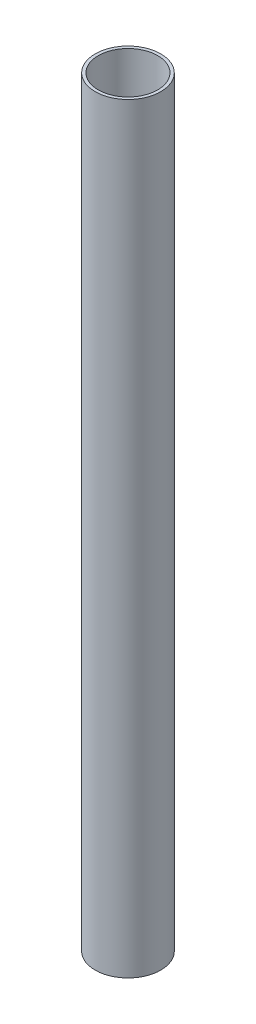
ISO-10303-21;
HEADER;
FILE_DESCRIPTION(('STEP AP214'),'2;1');
FILE_NAME('part.step','',(''),(''),'','','');
FILE_SCHEMA(('AUTOMOTIVE_DESIGN { 1 0 10303 214 1 1 1 1 }'));
ENDSEC;
DATA;
#1=APPLICATION_CONTEXT('core data for automotive mechanical design processes');
#2=APPLICATION_PROTOCOL_DEFINITION('international standard','automotive_design',2000,#1);
#3=PRODUCT_CONTEXT('',#1,'mechanical');
#4=PRODUCT('Part','Part','',(#3));
#5=PRODUCT_RELATED_PRODUCT_CATEGORY('part','',(#4));
#6=PRODUCT_DEFINITION_FORMATION('','',#4);
#7=PRODUCT_DEFINITION_CONTEXT('part definition',#1,'design');
#8=PRODUCT_DEFINITION('design','',#6,#7);
#9=PRODUCT_DEFINITION_SHAPE('','',#8);
#10=(LENGTH_UNIT() NAMED_UNIT(*) SI_UNIT(.MILLI.,.METRE.));
#11=(NAMED_UNIT(*) PLANE_ANGLE_UNIT() SI_UNIT($,.RADIAN.));
#12=(NAMED_UNIT(*) SI_UNIT($,.STERADIAN.) SOLID_ANGLE_UNIT());
#13=UNCERTAINTY_MEASURE_WITH_UNIT(LENGTH_MEASURE(1.E-05),#10,'distance_accuracy_value','');
#14=(GEOMETRIC_REPRESENTATION_CONTEXT(3) GLOBAL_UNCERTAINTY_ASSIGNED_CONTEXT((#13)) GLOBAL_UNIT_ASSIGNED_CONTEXT((#10,
#11,#12)) REPRESENTATION_CONTEXT('',''));
#15=CARTESIAN_POINT('',(0.,0.,0.));
#16=DIRECTION('',(0.,0.,1.));
#17=DIRECTION('',(1.,0.,0.));
#18=AXIS2_PLACEMENT_3D('',#15,#16,#17);
#19=CARTESIAN_POINT('',(0.,13.,0.));
#20=DIRECTION('',(0.,1.,0.));
#21=DIRECTION('',(0.,0.,1.));
#22=AXIS2_PLACEMENT_3D('',#19,#20,#21);
#23=PLANE('',#22);
#24=CARTESIAN_POINT('',(0.,13.,0.));
#25=DIRECTION('',(0.,1.,0.));
#26=DIRECTION('',(0.,0.,1.));
#27=AXIS2_PLACEMENT_3D('',#24,#25,#26);
#28=CIRCLE('',#27,0.56);
#29=CARTESIAN_POINT('',(0.,13.,0.56));
#30=VERTEX_POINT('',#29);
#31=EDGE_CURVE('E10',#30,#30,#28,.T.);
#32=ORIENTED_EDGE('',*,*,#31,.T.);
#33=EDGE_LOOP('',(#32));
#34=FACE_BOUND('',#33,.T.);
#35=CARTESIAN_POINT('',(0.,13.,0.));
#36=DIRECTION('',(0.,1.,0.));
#37=DIRECTION('',(0.,0.,1.));
#38=AXIS2_PLACEMENT_3D('',#35,#36,#37);
#39=CIRCLE('',#38,0.508);
#40=CARTESIAN_POINT('',(0.,13.,0.508));
#41=VERTEX_POINT('',#40);
#42=EDGE_CURVE('E50',#41,#41,#39,.T.);
#43=ORIENTED_EDGE('',*,*,#42,.F.);
#44=EDGE_LOOP('',(#43));
#45=FACE_BOUND('',#44,.T.);
#46=ADVANCED_FACE('F37',(#34,#45),#23,.T.);
#47=CARTESIAN_POINT('',(0.,0.,0.));
#48=DIRECTION('',(0.,1.,0.));
#49=DIRECTION('',(0.,0.,1.));
#50=AXIS2_PLACEMENT_3D('',#47,#48,#49);
#51=PLANE('',#50);
#52=CARTESIAN_POINT('',(0.,0.,0.));
#53=DIRECTION('',(0.,1.,0.));
#54=DIRECTION('',(0.,0.,1.));
#55=AXIS2_PLACEMENT_3D('',#52,#53,#54);
#56=CIRCLE('',#55,0.56);
#57=CARTESIAN_POINT('',(0.,0.,0.56));
#58=VERTEX_POINT('',#57);
#59=EDGE_CURVE('E41',#58,#58,#56,.T.);
#60=ORIENTED_EDGE('',*,*,#59,.F.);
#61=EDGE_LOOP('',(#60));
#62=FACE_BOUND('',#61,.T.);
#63=CARTESIAN_POINT('',(0.,0.,0.));
#64=DIRECTION('',(0.,1.,0.));
#65=DIRECTION('',(0.,0.,1.));
#66=AXIS2_PLACEMENT_3D('',#63,#64,#65);
#67=CIRCLE('',#66,0.508);
#68=CARTESIAN_POINT('',(0.,0.,0.508));
#69=VERTEX_POINT('',#68);
#70=EDGE_CURVE('E52',#69,#69,#67,.T.);
#71=ORIENTED_EDGE('',*,*,#70,.T.);
#72=EDGE_LOOP('',(#71));
#73=FACE_BOUND('',#72,.T.);
#74=ADVANCED_FACE('F64',(#62,#73),#51,.F.);
#75=CARTESIAN_POINT('',(0.,13.,0.));
#76=DIRECTION('',(0.,-1.,0.));
#77=DIRECTION('',(0.,0.,-1.));
#78=AXIS2_PLACEMENT_3D('',#75,#76,#77);
#79=CYLINDRICAL_SURFACE('',#78,0.56);
#80=ORIENTED_EDGE('',*,*,#31,.F.);
#81=EDGE_LOOP('',(#80));
#82=FACE_BOUND('',#81,.T.);
#83=ORIENTED_EDGE('',*,*,#59,.T.);
#84=EDGE_LOOP('',(#83));
#85=FACE_BOUND('',#84,.T.);
#86=ADVANCED_FACE('F39',(#82,#85),#79,.T.);
#87=CARTESIAN_POINT('',(0.,13.,0.));
#88=DIRECTION('',(0.,-1.,0.));
#89=DIRECTION('',(0.,0.,-1.));
#90=AXIS2_PLACEMENT_3D('',#87,#88,#89);
#91=CYLINDRICAL_SURFACE('',#90,0.508);
#92=ORIENTED_EDGE('',*,*,#42,.T.);
#93=EDGE_LOOP('',(#92));
#94=FACE_BOUND('',#93,.T.);
#95=ORIENTED_EDGE('',*,*,#70,.F.);
#96=EDGE_LOOP('',(#95));
#97=FACE_BOUND('',#96,.T.);
#98=ADVANCED_FACE('F60',(#94,#97),#91,.F.);
#99=CLOSED_SHELL('',(#46,#74,#86,#98));
#100=MANIFOLD_SOLID_BREP('B2',#99);
#101=ADVANCED_BREP_SHAPE_REPRESENTATION('',(#18,#100),#14);
#102=SHAPE_DEFINITION_REPRESENTATION(#9,#101);
ENDSEC;
END-ISO-10303-21;
